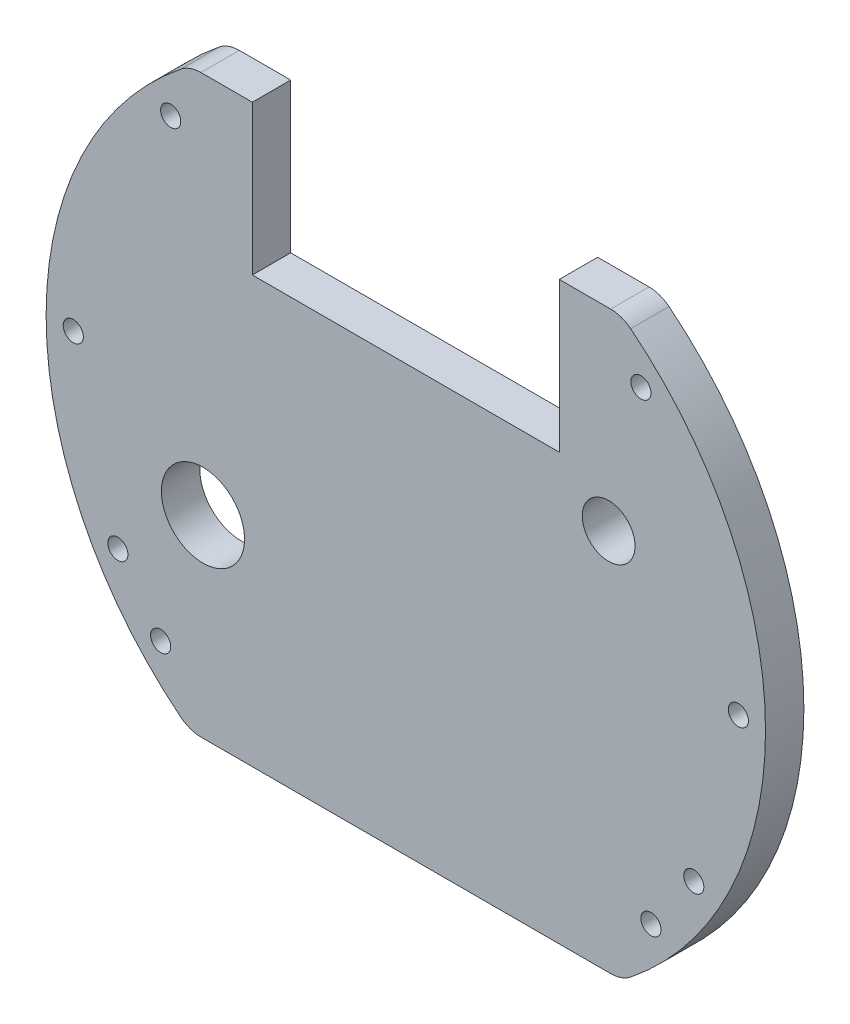
ISO-10303-21;
HEADER;
FILE_DESCRIPTION(('STEP AP214'),'2;1');
FILE_NAME('part.step','',(''),(''),'','','');
FILE_SCHEMA(('AUTOMOTIVE_DESIGN { 1 0 10303 214 1 1 1 1 }'));
ENDSEC;
DATA;
#1=APPLICATION_CONTEXT('core data for automotive mechanical design processes');
#2=APPLICATION_PROTOCOL_DEFINITION('international standard','automotive_design',2000,#1);
#3=PRODUCT_CONTEXT('',#1,'mechanical');
#4=PRODUCT('Part','Part','',(#3));
#5=PRODUCT_RELATED_PRODUCT_CATEGORY('part','',(#4));
#6=PRODUCT_DEFINITION_FORMATION('','',#4);
#7=PRODUCT_DEFINITION_CONTEXT('part definition',#1,'design');
#8=PRODUCT_DEFINITION('design','',#6,#7);
#9=PRODUCT_DEFINITION_SHAPE('','',#8);
#10=(LENGTH_UNIT() NAMED_UNIT(*) SI_UNIT(.MILLI.,.METRE.));
#11=(NAMED_UNIT(*) PLANE_ANGLE_UNIT() SI_UNIT($,.RADIAN.));
#12=(NAMED_UNIT(*) SI_UNIT($,.STERADIAN.) SOLID_ANGLE_UNIT());
#13=UNCERTAINTY_MEASURE_WITH_UNIT(LENGTH_MEASURE(1.E-05),#10,'distance_accuracy_value','');
#14=(GEOMETRIC_REPRESENTATION_CONTEXT(3) GLOBAL_UNCERTAINTY_ASSIGNED_CONTEXT((#13)) GLOBAL_UNIT_ASSIGNED_CONTEXT((#10,
#11,#12)) REPRESENTATION_CONTEXT('',''));
#15=CARTESIAN_POINT('',(0.,0.,0.));
#16=DIRECTION('',(0.,0.,1.));
#17=DIRECTION('',(1.,0.,0.));
#18=AXIS2_PLACEMENT_3D('',#15,#16,#17);
#19=CARTESIAN_POINT('',(-32.0400140449408,-40.,6.));
#20=DIRECTION('',(0.,0.,-1.));
#21=DIRECTION('',(-1.,0.,0.));
#22=AXIS2_PLACEMENT_3D('',#19,#20,#21);
#23=CYLINDRICAL_SURFACE('',#22,5.);
#24=CARTESIAN_POINT('',(-32.0400140449408,-40.,0.));
#25=DIRECTION('',(0.,0.,1.));
#26=DIRECTION('',(-1.,0.,0.));
#27=AXIS2_PLACEMENT_3D('',#24,#25,#26);
#28=CIRCLE('',#27,5.);
#29=CARTESIAN_POINT('',(-35.1658690737155,-43.9024390243902,0.));
#30=VERTEX_POINT('',#29);
#31=CARTESIAN_POINT('',(-32.0400140449408,-45.,0.));
#32=VERTEX_POINT('',#31);
#33=EDGE_CURVE('E164',#30,#32,#28,.T.);
#34=ORIENTED_EDGE('',*,*,#33,.T.);
#35=DIRECTION('',(0.,0.,-1.));
#36=VECTOR('',#35,1.);
#37=CARTESIAN_POINT('',(-32.0400140449408,-45.,6.));
#38=LINE('',#37,#36);
#39=CARTESIAN_POINT('',(-32.0400140449408,-45.,6.));
#40=VERTEX_POINT('',#39);
#41=EDGE_CURVE('E11',#40,#32,#38,.T.);
#42=ORIENTED_EDGE('',*,*,#41,.F.);
#43=CARTESIAN_POINT('',(-32.0400140449408,-40.,6.));
#44=DIRECTION('',(0.,0.,1.));
#45=DIRECTION('',(-1.,0.,0.));
#46=AXIS2_PLACEMENT_3D('',#43,#44,#45);
#47=CIRCLE('',#46,5.);
#48=CARTESIAN_POINT('',(-35.1658690737155,-43.9024390243902,6.));
#49=VERTEX_POINT('',#48);
#50=EDGE_CURVE('E187',#49,#40,#47,.T.);
#51=ORIENTED_EDGE('',*,*,#50,.F.);
#52=DIRECTION('',(0.,0.,-1.));
#53=VECTOR('',#52,1.);
#54=CARTESIAN_POINT('',(-35.1658690737155,-43.9024390243902,6.));
#55=LINE('',#54,#53);
#56=EDGE_CURVE('E160',#49,#30,#55,.T.);
#57=ORIENTED_EDGE('',*,*,#56,.T.);
#58=EDGE_LOOP('',(#34,#42,#51,#57));
#59=FACE_BOUND('',#58,.T.);
#60=ADVANCED_FACE('F44',(#59),#23,.T.);
#61=CARTESIAN_POINT('',(32.0400140449408,-45.,6.));
#62=DIRECTION('',(0.,1.,0.));
#63=DIRECTION('',(0.,0.,1.));
#64=AXIS2_PLACEMENT_3D('',#61,#62,#63);
#65=PLANE('',#64);
#66=DIRECTION('',(1.,0.,0.));
#67=VECTOR('',#66,1.);
#68=CARTESIAN_POINT('',(32.0400140449408,-45.,0.));
#69=LINE('',#68,#67);
#70=CARTESIAN_POINT('',(32.0400140449408,-45.,0.));
#71=VERTEX_POINT('',#70);
#72=EDGE_CURVE('E167',#32,#71,#69,.T.);
#73=ORIENTED_EDGE('',*,*,#72,.T.);
#74=DIRECTION('',(0.,0.,-1.));
#75=VECTOR('',#74,1.);
#76=CARTESIAN_POINT('',(32.0400140449408,-45.,6.));
#77=LINE('',#76,#75);
#78=CARTESIAN_POINT('',(32.0400140449408,-45.,6.));
#79=VERTEX_POINT('',#78);
#80=EDGE_CURVE('E52',#79,#71,#77,.T.);
#81=ORIENTED_EDGE('',*,*,#80,.F.);
#82=DIRECTION('',(1.,0.,0.));
#83=VECTOR('',#82,1.);
#84=CARTESIAN_POINT('',(32.0400140449408,-45.,6.));
#85=LINE('',#84,#83);
#86=EDGE_CURVE('E115',#40,#79,#85,.T.);
#87=ORIENTED_EDGE('',*,*,#86,.F.);
#88=ORIENTED_EDGE('',*,*,#41,.T.);
#89=EDGE_LOOP('',(#73,#81,#87,#88));
#90=FACE_BOUND('',#89,.T.);
#91=ADVANCED_FACE('F266',(#90),#65,.F.);
#92=CARTESIAN_POINT('',(32.0400140449408,-40.,6.));
#93=DIRECTION('',(0.,0.,-1.));
#94=DIRECTION('',(-1.,0.,0.));
#95=AXIS2_PLACEMENT_3D('',#92,#93,#94);
#96=CYLINDRICAL_SURFACE('',#95,5.);
#97=CARTESIAN_POINT('',(32.0400140449408,-40.,0.));
#98=DIRECTION('',(0.,0.,1.));
#99=DIRECTION('',(1.,0.,0.));
#100=AXIS2_PLACEMENT_3D('',#97,#98,#99);
#101=CIRCLE('',#100,5.);
#102=CARTESIAN_POINT('',(35.1658690737155,-43.9024390243902,0.));
#103=VERTEX_POINT('',#102);
#104=EDGE_CURVE('E170',#71,#103,#101,.T.);
#105=ORIENTED_EDGE('',*,*,#104,.T.);
#106=DIRECTION('',(0.,0.,-1.));
#107=VECTOR('',#106,1.);
#108=CARTESIAN_POINT('',(35.1658690737155,-43.9024390243902,6.));
#109=LINE('',#108,#107);
#110=CARTESIAN_POINT('',(35.1658690737155,-43.9024390243902,6.));
#111=VERTEX_POINT('',#110);
#112=EDGE_CURVE('E206',#111,#103,#109,.T.);
#113=ORIENTED_EDGE('',*,*,#112,.F.);
#114=CARTESIAN_POINT('',(32.0400140449408,-40.,6.));
#115=DIRECTION('',(0.,0.,1.));
#116=DIRECTION('',(1.,0.,0.));
#117=AXIS2_PLACEMENT_3D('',#114,#115,#116);
#118=CIRCLE('',#117,5.);
#119=EDGE_CURVE('E214',#79,#111,#118,.T.);
#120=ORIENTED_EDGE('',*,*,#119,.F.);
#121=ORIENTED_EDGE('',*,*,#80,.T.);
#122=EDGE_LOOP('',(#105,#113,#120,#121));
#123=FACE_BOUND('',#122,.T.);
#124=ADVANCED_FACE('F212',(#123),#96,.T.);
#125=CARTESIAN_POINT('',(0.,0.,6.));
#126=DIRECTION('',(0.,0.,-1.));
#127=DIRECTION('',(-1.,0.,0.));
#128=AXIS2_PLACEMENT_3D('',#125,#126,#127);
#129=CYLINDRICAL_SURFACE('',#128,56.25);
#130=CARTESIAN_POINT('',(0.,0.,0.));
#131=DIRECTION('',(0.,0.,1.));
#132=DIRECTION('',(1.,0.,0.));
#133=AXIS2_PLACEMENT_3D('',#130,#131,#132);
#134=CIRCLE('',#133,56.25);
#135=CARTESIAN_POINT('',(35.1658690737155,43.9024390243902,0.));
#136=VERTEX_POINT('',#135);
#137=EDGE_CURVE('E172',#103,#136,#134,.T.);
#138=ORIENTED_EDGE('',*,*,#137,.T.);
#139=DIRECTION('',(0.,0.,-1.));
#140=VECTOR('',#139,1.);
#141=CARTESIAN_POINT('',(35.1658690737155,43.9024390243902,6.));
#142=LINE('',#141,#140);
#143=CARTESIAN_POINT('',(35.1658690737155,43.9024390243902,6.));
#144=VERTEX_POINT('',#143);
#145=EDGE_CURVE('E203',#144,#136,#142,.T.);
#146=ORIENTED_EDGE('',*,*,#145,.F.);
#147=CARTESIAN_POINT('',(0.,0.,6.));
#148=DIRECTION('',(0.,0.,1.));
#149=DIRECTION('',(1.,0.,0.));
#150=AXIS2_PLACEMENT_3D('',#147,#148,#149);
#151=CIRCLE('',#150,56.25);
#152=EDGE_CURVE('E232',#111,#144,#151,.T.);
#153=ORIENTED_EDGE('',*,*,#152,.F.);
#154=ORIENTED_EDGE('',*,*,#112,.T.);
#155=EDGE_LOOP('',(#138,#146,#153,#154));
#156=FACE_BOUND('',#155,.T.);
#157=ADVANCED_FACE('F223',(#156),#129,.T.);
#158=CARTESIAN_POINT('',(32.0400140449408,40.,6.));
#159=DIRECTION('',(0.,0.,-1.));
#160=DIRECTION('',(-1.,0.,0.));
#161=AXIS2_PLACEMENT_3D('',#158,#159,#160);
#162=CYLINDRICAL_SURFACE('',#161,5.);
#163=CARTESIAN_POINT('',(32.0400140449408,40.,0.));
#164=DIRECTION('',(0.,0.,1.));
#165=DIRECTION('',(-1.,0.,0.));
#166=AXIS2_PLACEMENT_3D('',#163,#164,#165);
#167=CIRCLE('',#166,5.);
#168=CARTESIAN_POINT('',(32.0400140449408,45.,0.));
#169=VERTEX_POINT('',#168);
#170=EDGE_CURVE('E174',#136,#169,#167,.T.);
#171=ORIENTED_EDGE('',*,*,#170,.T.);
#172=DIRECTION('',(0.,0.,-1.));
#173=VECTOR('',#172,1.);
#174=CARTESIAN_POINT('',(32.0400140449408,45.,6.));
#175=LINE('',#174,#173);
#176=CARTESIAN_POINT('',(32.0400140449408,45.,6.));
#177=VERTEX_POINT('',#176);
#178=EDGE_CURVE('E200',#177,#169,#175,.T.);
#179=ORIENTED_EDGE('',*,*,#178,.F.);
#180=CARTESIAN_POINT('',(32.0400140449408,40.,6.));
#181=DIRECTION('',(0.,0.,1.));
#182=DIRECTION('',(-1.,0.,0.));
#183=AXIS2_PLACEMENT_3D('',#180,#181,#182);
#184=CIRCLE('',#183,5.);
#185=EDGE_CURVE('E229',#144,#177,#184,.T.);
#186=ORIENTED_EDGE('',*,*,#185,.F.);
#187=ORIENTED_EDGE('',*,*,#145,.T.);
#188=EDGE_LOOP('',(#171,#179,#186,#187));
#189=FACE_BOUND('',#188,.T.);
#190=ADVANCED_FACE('F227',(#189),#162,.T.);
#191=CARTESIAN_POINT('',(32.0400140449408,45.,6.));
#192=DIRECTION('',(0.,-1.,0.));
#193=DIRECTION('',(0.,0.,-1.));
#194=AXIS2_PLACEMENT_3D('',#191,#192,#193);
#195=PLANE('',#194);
#196=DIRECTION('',(-1.,0.,0.));
#197=VECTOR('',#196,1.);
#198=CARTESIAN_POINT('',(32.0400140449408,45.,0.));
#199=LINE('',#198,#197);
#200=CARTESIAN_POINT('',(24.,45.,0.));
#201=VERTEX_POINT('',#200);
#202=EDGE_CURVE('E176',#169,#201,#199,.T.);
#203=ORIENTED_EDGE('',*,*,#202,.T.);
#204=DIRECTION('',(0.,0.,-1.));
#205=VECTOR('',#204,1.);
#206=CARTESIAN_POINT('',(24.,45.,6.));
#207=LINE('',#206,#205);
#208=CARTESIAN_POINT('',(24.,45.,6.));
#209=VERTEX_POINT('',#208);
#210=EDGE_CURVE('E197',#209,#201,#207,.T.);
#211=ORIENTED_EDGE('',*,*,#210,.F.);
#212=DIRECTION('',(-1.,0.,0.));
#213=VECTOR('',#212,1.);
#214=CARTESIAN_POINT('',(32.0400140449408,45.,6.));
#215=LINE('',#214,#213);
#216=EDGE_CURVE('E231',#177,#209,#215,.T.);
#217=ORIENTED_EDGE('',*,*,#216,.F.);
#218=ORIENTED_EDGE('',*,*,#178,.T.);
#219=EDGE_LOOP('',(#203,#211,#217,#218));
#220=FACE_BOUND('',#219,.T.);
#221=ADVANCED_FACE('F279',(#220),#195,.F.);
#222=CARTESIAN_POINT('',(24.,21.6,6.));
#223=DIRECTION('',(1.,0.,0.));
#224=DIRECTION('',(0.,0.,-1.));
#225=AXIS2_PLACEMENT_3D('',#222,#223,#224);
#226=PLANE('',#225);
#227=DIRECTION('',(0.,-1.,0.));
#228=VECTOR('',#227,1.);
#229=CARTESIAN_POINT('',(24.,21.6,0.));
#230=LINE('',#229,#228);
#231=CARTESIAN_POINT('',(24.,21.6,0.));
#232=VERTEX_POINT('',#231);
#233=EDGE_CURVE('E178',#201,#232,#230,.T.);
#234=ORIENTED_EDGE('',*,*,#233,.T.);
#235=DIRECTION('',(0.,0.,-1.));
#236=VECTOR('',#235,1.);
#237=CARTESIAN_POINT('',(24.,21.6,6.));
#238=LINE('',#237,#236);
#239=CARTESIAN_POINT('',(24.,21.6,6.));
#240=VERTEX_POINT('',#239);
#241=EDGE_CURVE('E194',#240,#232,#238,.T.);
#242=ORIENTED_EDGE('',*,*,#241,.F.);
#243=DIRECTION('',(0.,-1.,0.));
#244=VECTOR('',#243,1.);
#245=CARTESIAN_POINT('',(24.,21.6,6.));
#246=LINE('',#245,#244);
#247=EDGE_CURVE('E234',#209,#240,#246,.T.);
#248=ORIENTED_EDGE('',*,*,#247,.F.);
#249=ORIENTED_EDGE('',*,*,#210,.T.);
#250=EDGE_LOOP('',(#234,#242,#248,#249));
#251=FACE_BOUND('',#250,.T.);
#252=ADVANCED_FACE('F282',(#251),#226,.F.);
#253=CARTESIAN_POINT('',(24.,21.6,6.));
#254=DIRECTION('',(0.,-1.,0.));
#255=DIRECTION('',(1.,0.,0.));
#256=AXIS2_PLACEMENT_3D('',#253,#254,#255);
#257=PLANE('',#256);
#258=DIRECTION('',(-1.,0.,0.));
#259=VECTOR('',#258,1.);
#260=CARTESIAN_POINT('',(24.,21.6,0.));
#261=LINE('',#260,#259);
#262=CARTESIAN_POINT('',(-24.,21.6,0.));
#263=VERTEX_POINT('',#262);
#264=EDGE_CURVE('E180',#232,#263,#261,.T.);
#265=ORIENTED_EDGE('',*,*,#264,.T.);
#266=DIRECTION('',(0.,0.,-1.));
#267=VECTOR('',#266,1.);
#268=CARTESIAN_POINT('',(-24.,21.6,6.));
#269=LINE('',#268,#267);
#270=CARTESIAN_POINT('',(-24.,21.6,6.));
#271=VERTEX_POINT('',#270);
#272=EDGE_CURVE('E191',#271,#263,#269,.T.);
#273=ORIENTED_EDGE('',*,*,#272,.F.);
#274=DIRECTION('',(-1.,0.,0.));
#275=VECTOR('',#274,1.);
#276=CARTESIAN_POINT('',(24.,21.6,6.));
#277=LINE('',#276,#275);
#278=EDGE_CURVE('E240',#240,#271,#277,.T.);
#279=ORIENTED_EDGE('',*,*,#278,.F.);
#280=ORIENTED_EDGE('',*,*,#241,.T.);
#281=EDGE_LOOP('',(#265,#273,#279,#280));
#282=FACE_BOUND('',#281,.T.);
#283=ADVANCED_FACE('F246',(#282),#257,.F.);
#284=CARTESIAN_POINT('',(-24.,21.6,6.));
#285=DIRECTION('',(-1.,0.,0.));
#286=DIRECTION('',(0.,-1.,0.));
#287=AXIS2_PLACEMENT_3D('',#284,#285,#286);
#288=PLANE('',#287);
#289=DIRECTION('',(0.,1.,0.));
#290=VECTOR('',#289,1.);
#291=CARTESIAN_POINT('',(-24.,21.6,0.));
#292=LINE('',#291,#290);
#293=CARTESIAN_POINT('',(-24.,45.,0.));
#294=VERTEX_POINT('',#293);
#295=EDGE_CURVE('E182',#263,#294,#292,.T.);
#296=ORIENTED_EDGE('',*,*,#295,.T.);
#297=DIRECTION('',(0.,0.,-1.));
#298=VECTOR('',#297,1.);
#299=CARTESIAN_POINT('',(-24.,45.,6.));
#300=LINE('',#299,#298);
#301=CARTESIAN_POINT('',(-24.,45.,6.));
#302=VERTEX_POINT('',#301);
#303=EDGE_CURVE('E155',#302,#294,#300,.T.);
#304=ORIENTED_EDGE('',*,*,#303,.F.);
#305=DIRECTION('',(0.,1.,0.));
#306=VECTOR('',#305,1.);
#307=CARTESIAN_POINT('',(-24.,21.6,6.));
#308=LINE('',#307,#306);
#309=EDGE_CURVE('E146',#271,#302,#308,.T.);
#310=ORIENTED_EDGE('',*,*,#309,.F.);
#311=ORIENTED_EDGE('',*,*,#272,.T.);
#312=EDGE_LOOP('',(#296,#304,#310,#311));
#313=FACE_BOUND('',#312,.T.);
#314=ADVANCED_FACE('F250',(#313),#288,.F.);
#315=CARTESIAN_POINT('',(-24.,45.,6.));
#316=DIRECTION('',(0.,-1.,0.));
#317=DIRECTION('',(0.,0.,-1.));
#318=AXIS2_PLACEMENT_3D('',#315,#316,#317);
#319=PLANE('',#318);
#320=DIRECTION('',(-1.,0.,0.));
#321=VECTOR('',#320,1.);
#322=CARTESIAN_POINT('',(-24.,45.,0.));
#323=LINE('',#322,#321);
#324=CARTESIAN_POINT('',(-32.0400140449408,45.,0.));
#325=VERTEX_POINT('',#324);
#326=EDGE_CURVE('E154',#294,#325,#323,.T.);
#327=ORIENTED_EDGE('',*,*,#326,.T.);
#328=DIRECTION('',(0.,0.,-1.));
#329=VECTOR('',#328,1.);
#330=CARTESIAN_POINT('',(-32.0400140449408,45.,6.));
#331=LINE('',#330,#329);
#332=CARTESIAN_POINT('',(-32.0400140449408,45.,6.));
#333=VERTEX_POINT('',#332);
#334=EDGE_CURVE('E151',#333,#325,#331,.T.);
#335=ORIENTED_EDGE('',*,*,#334,.F.);
#336=DIRECTION('',(-1.,0.,0.));
#337=VECTOR('',#336,1.);
#338=CARTESIAN_POINT('',(-24.,45.,6.));
#339=LINE('',#338,#337);
#340=EDGE_CURVE('E140',#302,#333,#339,.T.);
#341=ORIENTED_EDGE('',*,*,#340,.F.);
#342=ORIENTED_EDGE('',*,*,#303,.T.);
#343=EDGE_LOOP('',(#327,#335,#341,#342));
#344=FACE_BOUND('',#343,.T.);
#345=ADVANCED_FACE('F152',(#344),#319,.F.);
#346=CARTESIAN_POINT('',(-32.0400140449408,40.,6.));
#347=DIRECTION('',(0.,0.,-1.));
#348=DIRECTION('',(-1.,0.,0.));
#349=AXIS2_PLACEMENT_3D('',#346,#347,#348);
#350=CYLINDRICAL_SURFACE('',#349,5.);
#351=CARTESIAN_POINT('',(-32.0400140449408,40.,0.));
#352=DIRECTION('',(0.,0.,1.));
#353=DIRECTION('',(1.,0.,0.));
#354=AXIS2_PLACEMENT_3D('',#351,#352,#353);
#355=CIRCLE('',#354,5.);
#356=CARTESIAN_POINT('',(-35.1658690737155,43.9024390243902,0.));
#357=VERTEX_POINT('',#356);
#358=EDGE_CURVE('E101',#325,#357,#355,.T.);
#359=ORIENTED_EDGE('',*,*,#358,.T.);
#360=DIRECTION('',(0.,0.,-1.));
#361=VECTOR('',#360,1.);
#362=CARTESIAN_POINT('',(-35.1658690737155,43.9024390243902,6.));
#363=LINE('',#362,#361);
#364=CARTESIAN_POINT('',(-35.1658690737155,43.9024390243902,6.));
#365=VERTEX_POINT('',#364);
#366=EDGE_CURVE('E156',#365,#357,#363,.T.);
#367=ORIENTED_EDGE('',*,*,#366,.F.);
#368=CARTESIAN_POINT('',(-32.0400140449408,40.,6.));
#369=DIRECTION('',(0.,0.,1.));
#370=DIRECTION('',(1.,0.,0.));
#371=AXIS2_PLACEMENT_3D('',#368,#369,#370);
#372=CIRCLE('',#371,5.);
#373=EDGE_CURVE('E144',#333,#365,#372,.T.);
#374=ORIENTED_EDGE('',*,*,#373,.F.);
#375=ORIENTED_EDGE('',*,*,#334,.T.);
#376=EDGE_LOOP('',(#359,#367,#374,#375));
#377=FACE_BOUND('',#376,.T.);
#378=ADVANCED_FACE('F158',(#377),#350,.T.);
#379=CARTESIAN_POINT('',(0.,0.,6.));
#380=DIRECTION('',(0.,0.,-1.));
#381=DIRECTION('',(-1.,0.,0.));
#382=AXIS2_PLACEMENT_3D('',#379,#380,#381);
#383=CYLINDRICAL_SURFACE('',#382,56.25);
#384=CARTESIAN_POINT('',(0.,0.,0.));
#385=DIRECTION('',(0.,0.,1.));
#386=DIRECTION('',(1.,0.,0.));
#387=AXIS2_PLACEMENT_3D('',#384,#385,#386);
#388=CIRCLE('',#387,56.25);
#389=EDGE_CURVE('E107',#357,#30,#388,.T.);
#390=ORIENTED_EDGE('',*,*,#389,.T.);
#391=ORIENTED_EDGE('',*,*,#56,.F.);
#392=CARTESIAN_POINT('',(0.,0.,6.));
#393=DIRECTION('',(0.,0.,1.));
#394=DIRECTION('',(1.,0.,0.));
#395=AXIS2_PLACEMENT_3D('',#392,#393,#394);
#396=CIRCLE('',#395,56.25);
#397=EDGE_CURVE('E60',#365,#49,#396,.T.);
#398=ORIENTED_EDGE('',*,*,#397,.F.);
#399=ORIENTED_EDGE('',*,*,#366,.T.);
#400=EDGE_LOOP('',(#390,#391,#398,#399));
#401=FACE_BOUND('',#400,.T.);
#402=ADVANCED_FACE('F254',(#401),#383,.T.);
#403=CARTESIAN_POINT('',(-32.0400140449408,-40.,6.));
#404=DIRECTION('',(0.,0.,-1.));
#405=DIRECTION('',(-1.,0.,0.));
#406=AXIS2_PLACEMENT_3D('',#403,#404,#405);
#407=PLANE('',#406);
#408=CARTESIAN_POINT('',(-31.7207725462826,-14.7916391609247,6.));
#409=DIRECTION('',(0.,0.,-1.));
#410=DIRECTION('',(-1.,0.,0.));
#411=AXIS2_PLACEMENT_3D('',#408,#409,#410);
#412=CIRCLE('',#411,6.5);
#413=CARTESIAN_POINT('',(-38.2207725462826,-14.7916391609247,6.));
#414=VERTEX_POINT('',#413);
#415=EDGE_CURVE('E576',#414,#414,#412,.T.);
#416=ORIENTED_EDGE('',*,*,#415,.T.);
#417=EDGE_LOOP('',(#416));
#418=FACE_BOUND('',#417,.T.);
#419=CARTESIAN_POINT('',(31.7207725462827,14.7916391609245,6.));
#420=DIRECTION('',(0.,0.,-1.));
#421=DIRECTION('',(-1.,0.,0.));
#422=AXIS2_PLACEMENT_3D('',#419,#420,#421);
#423=CIRCLE('',#422,4.125);
#424=CARTESIAN_POINT('',(27.5957725462827,14.7916391609245,6.));
#425=VERTEX_POINT('',#424);
#426=EDGE_CURVE('E580',#425,#425,#423,.T.);
#427=ORIENTED_EDGE('',*,*,#426,.T.);
#428=EDGE_LOOP('',(#427));
#429=FACE_BOUND('',#428,.T.);
#430=CARTESIAN_POINT('',(36.7695526217004,36.7695526217005,6.));
#431=DIRECTION('',(0.,0.,-1.));
#432=DIRECTION('',(-1.,0.,0.));
#433=AXIS2_PLACEMENT_3D('',#430,#431,#432);
#434=CIRCLE('',#433,1.575);
#435=CARTESIAN_POINT('',(35.1945526217004,36.7695526217005,6.));
#436=VERTEX_POINT('',#435);
#437=EDGE_CURVE('E589',#436,#436,#434,.T.);
#438=ORIENTED_EDGE('',*,*,#437,.T.);
#439=EDGE_LOOP('',(#438));
#440=FACE_BOUND('',#439,.T.);
#441=CARTESIAN_POINT('',(52.,-3.63114059239686E-13,6.));
#442=DIRECTION('',(0.,0.,-1.));
#443=DIRECTION('',(-1.,0.,0.));
#444=AXIS2_PLACEMENT_3D('',#441,#442,#443);
#445=CIRCLE('',#444,1.575);
#446=CARTESIAN_POINT('',(50.425,-3.63114059239686E-13,6.));
#447=VERTEX_POINT('',#446);
#448=EDGE_CURVE('E595',#447,#447,#445,.T.);
#449=ORIENTED_EDGE('',*,*,#448,.T.);
#450=EDGE_LOOP('',(#449));
#451=FACE_BOUND('',#450,.T.);
#452=CARTESIAN_POINT('',(45.0333209967908,-26.0000000000001,6.));
#453=DIRECTION('',(0.,0.,-1.));
#454=DIRECTION('',(-1.,0.,0.));
#455=AXIS2_PLACEMENT_3D('',#452,#453,#454);
#456=CIRCLE('',#455,1.575);
#457=CARTESIAN_POINT('',(43.4583209967908,-26.0000000000001,6.));
#458=VERTEX_POINT('',#457);
#459=EDGE_CURVE('E601',#458,#458,#456,.T.);
#460=ORIENTED_EDGE('',*,*,#459,.T.);
#461=EDGE_LOOP('',(#460));
#462=FACE_BOUND('',#461,.T.);
#463=CARTESIAN_POINT('',(-45.0333209967908,-26.,6.));
#464=DIRECTION('',(0.,0.,-1.));
#465=DIRECTION('',(-1.,0.,0.));
#466=AXIS2_PLACEMENT_3D('',#463,#464,#465);
#467=CIRCLE('',#466,1.575);
#468=CARTESIAN_POINT('',(-46.6083209967908,-26.,6.));
#469=VERTEX_POINT('',#468);
#470=EDGE_CURVE('E607',#469,#469,#467,.T.);
#471=ORIENTED_EDGE('',*,*,#470,.T.);
#472=EDGE_LOOP('',(#471));
#473=FACE_BOUND('',#472,.T.);
#474=CARTESIAN_POINT('',(-52.,0.,6.));
#475=DIRECTION('',(0.,0.,-1.));
#476=DIRECTION('',(-1.,0.,0.));
#477=AXIS2_PLACEMENT_3D('',#474,#475,#476);
#478=CIRCLE('',#477,1.575);
#479=CARTESIAN_POINT('',(-53.575,0.,6.));
#480=VERTEX_POINT('',#479);
#481=EDGE_CURVE('E613',#480,#480,#478,.T.);
#482=ORIENTED_EDGE('',*,*,#481,.T.);
#483=EDGE_LOOP('',(#482));
#484=FACE_BOUND('',#483,.T.);
#485=CARTESIAN_POINT('',(-36.7695526217004,36.7695526217005,6.));
#486=DIRECTION('',(0.,0.,-1.));
#487=DIRECTION('',(-1.,0.,0.));
#488=AXIS2_PLACEMENT_3D('',#485,#486,#487);
#489=CIRCLE('',#488,1.575);
#490=CARTESIAN_POINT('',(-38.3445526217004,36.7695526217005,6.));
#491=VERTEX_POINT('',#490);
#492=EDGE_CURVE('E619',#491,#491,#489,.T.);
#493=ORIENTED_EDGE('',*,*,#492,.T.);
#494=EDGE_LOOP('',(#493));
#495=FACE_BOUND('',#494,.T.);
#496=CARTESIAN_POINT('',(38.3384215141264,-35.1306907960144,6.));
#497=DIRECTION('',(0.,0.,-1.));
#498=DIRECTION('',(-1.,0.,0.));
#499=AXIS2_PLACEMENT_3D('',#496,#497,#498);
#500=CIRCLE('',#499,1.575);
#501=CARTESIAN_POINT('',(36.7634215141264,-35.1306907960144,6.));
#502=VERTEX_POINT('',#501);
#503=EDGE_CURVE('E625',#502,#502,#500,.T.);
#504=ORIENTED_EDGE('',*,*,#503,.T.);
#505=EDGE_LOOP('',(#504));
#506=FACE_BOUND('',#505,.T.);
#507=CARTESIAN_POINT('',(-38.3384215141264,-35.1306907960144,6.));
#508=DIRECTION('',(0.,0.,-1.));
#509=DIRECTION('',(-1.,0.,0.));
#510=AXIS2_PLACEMENT_3D('',#507,#508,#509);
#511=CIRCLE('',#510,1.575);
#512=CARTESIAN_POINT('',(-39.9134215141264,-35.1306907960144,6.));
#513=VERTEX_POINT('',#512);
#514=EDGE_CURVE('E168',#513,#513,#511,.T.);
#515=ORIENTED_EDGE('',*,*,#514,.T.);
#516=EDGE_LOOP('',(#515));
#517=FACE_BOUND('',#516,.T.);
#518=ORIENTED_EDGE('',*,*,#50,.T.);
#519=ORIENTED_EDGE('',*,*,#86,.T.);
#520=ORIENTED_EDGE('',*,*,#119,.T.);
#521=ORIENTED_EDGE('',*,*,#152,.T.);
#522=ORIENTED_EDGE('',*,*,#185,.T.);
#523=ORIENTED_EDGE('',*,*,#216,.T.);
#524=ORIENTED_EDGE('',*,*,#247,.T.);
#525=ORIENTED_EDGE('',*,*,#278,.T.);
#526=ORIENTED_EDGE('',*,*,#309,.T.);
#527=ORIENTED_EDGE('',*,*,#340,.T.);
#528=ORIENTED_EDGE('',*,*,#373,.T.);
#529=ORIENTED_EDGE('',*,*,#397,.T.);
#530=EDGE_LOOP('',(#518,#519,#520,#521,#522,#523,#524,#525,#526,#527,#528,#529));
#531=FACE_BOUND('',#530,.T.);
#532=ADVANCED_FACE('F142',(#418,#429,#440,#451,#462,#473,#484,#495,#506,#517,#531),#407,.F.);
#533=CARTESIAN_POINT('',(-32.0400140449408,-40.,0.));
#534=DIRECTION('',(0.,0.,-1.));
#535=DIRECTION('',(-1.,0.,0.));
#536=AXIS2_PLACEMENT_3D('',#533,#534,#535);
#537=PLANE('',#536);
#538=CARTESIAN_POINT('',(-31.7207725462826,-14.7916391609247,0.));
#539=DIRECTION('',(0.,0.,-1.));
#540=DIRECTION('',(-1.,0.,0.));
#541=AXIS2_PLACEMENT_3D('',#538,#539,#540);
#542=CIRCLE('',#541,6.5);
#543=CARTESIAN_POINT('',(-38.2207725462826,-14.7916391609247,0.));
#544=VERTEX_POINT('',#543);
#545=EDGE_CURVE('E573',#544,#544,#542,.T.);
#546=ORIENTED_EDGE('',*,*,#545,.F.);
#547=EDGE_LOOP('',(#546));
#548=FACE_BOUND('',#547,.T.);
#549=CARTESIAN_POINT('',(31.7207725462827,14.7916391609245,0.));
#550=DIRECTION('',(0.,0.,-1.));
#551=DIRECTION('',(-1.,0.,0.));
#552=AXIS2_PLACEMENT_3D('',#549,#550,#551);
#553=CIRCLE('',#552,4.125);
#554=CARTESIAN_POINT('',(27.5957725462827,14.7916391609245,0.));
#555=VERTEX_POINT('',#554);
#556=EDGE_CURVE('E577',#555,#555,#553,.T.);
#557=ORIENTED_EDGE('',*,*,#556,.F.);
#558=EDGE_LOOP('',(#557));
#559=FACE_BOUND('',#558,.T.);
#560=CARTESIAN_POINT('',(36.7695526217004,36.7695526217005,0.));
#561=DIRECTION('',(0.,0.,-1.));
#562=DIRECTION('',(-1.,0.,0.));
#563=AXIS2_PLACEMENT_3D('',#560,#561,#562);
#564=CIRCLE('',#563,1.575);
#565=CARTESIAN_POINT('',(35.1945526217004,36.7695526217005,0.));
#566=VERTEX_POINT('',#565);
#567=EDGE_CURVE('E586',#566,#566,#564,.T.);
#568=ORIENTED_EDGE('',*,*,#567,.F.);
#569=EDGE_LOOP('',(#568));
#570=FACE_BOUND('',#569,.T.);
#571=CARTESIAN_POINT('',(52.,-3.63114059239686E-13,0.));
#572=DIRECTION('',(0.,0.,-1.));
#573=DIRECTION('',(-1.,0.,0.));
#574=AXIS2_PLACEMENT_3D('',#571,#572,#573);
#575=CIRCLE('',#574,1.575);
#576=CARTESIAN_POINT('',(50.425,-3.63114059239686E-13,0.));
#577=VERTEX_POINT('',#576);
#578=EDGE_CURVE('E592',#577,#577,#575,.T.);
#579=ORIENTED_EDGE('',*,*,#578,.F.);
#580=EDGE_LOOP('',(#579));
#581=FACE_BOUND('',#580,.T.);
#582=CARTESIAN_POINT('',(45.0333209967908,-26.0000000000001,0.));
#583=DIRECTION('',(0.,0.,-1.));
#584=DIRECTION('',(-1.,0.,0.));
#585=AXIS2_PLACEMENT_3D('',#582,#583,#584);
#586=CIRCLE('',#585,1.575);
#587=CARTESIAN_POINT('',(43.4583209967908,-26.0000000000001,0.));
#588=VERTEX_POINT('',#587);
#589=EDGE_CURVE('E598',#588,#588,#586,.T.);
#590=ORIENTED_EDGE('',*,*,#589,.F.);
#591=EDGE_LOOP('',(#590));
#592=FACE_BOUND('',#591,.T.);
#593=CARTESIAN_POINT('',(-45.0333209967908,-26.,0.));
#594=DIRECTION('',(0.,0.,-1.));
#595=DIRECTION('',(-1.,0.,0.));
#596=AXIS2_PLACEMENT_3D('',#593,#594,#595);
#597=CIRCLE('',#596,1.575);
#598=CARTESIAN_POINT('',(-46.6083209967908,-26.,0.));
#599=VERTEX_POINT('',#598);
#600=EDGE_CURVE('E604',#599,#599,#597,.T.);
#601=ORIENTED_EDGE('',*,*,#600,.F.);
#602=EDGE_LOOP('',(#601));
#603=FACE_BOUND('',#602,.T.);
#604=CARTESIAN_POINT('',(-52.,0.,0.));
#605=DIRECTION('',(0.,0.,-1.));
#606=DIRECTION('',(-1.,0.,0.));
#607=AXIS2_PLACEMENT_3D('',#604,#605,#606);
#608=CIRCLE('',#607,1.575);
#609=CARTESIAN_POINT('',(-53.575,0.,0.));
#610=VERTEX_POINT('',#609);
#611=EDGE_CURVE('E610',#610,#610,#608,.T.);
#612=ORIENTED_EDGE('',*,*,#611,.F.);
#613=EDGE_LOOP('',(#612));
#614=FACE_BOUND('',#613,.T.);
#615=CARTESIAN_POINT('',(-36.7695526217004,36.7695526217005,0.));
#616=DIRECTION('',(0.,0.,-1.));
#617=DIRECTION('',(-1.,0.,0.));
#618=AXIS2_PLACEMENT_3D('',#615,#616,#617);
#619=CIRCLE('',#618,1.575);
#620=CARTESIAN_POINT('',(-38.3445526217004,36.7695526217005,0.));
#621=VERTEX_POINT('',#620);
#622=EDGE_CURVE('E616',#621,#621,#619,.T.);
#623=ORIENTED_EDGE('',*,*,#622,.F.);
#624=EDGE_LOOP('',(#623));
#625=FACE_BOUND('',#624,.T.);
#626=CARTESIAN_POINT('',(38.3384215141264,-35.1306907960144,0.));
#627=DIRECTION('',(0.,0.,-1.));
#628=DIRECTION('',(-1.,0.,0.));
#629=AXIS2_PLACEMENT_3D('',#626,#627,#628);
#630=CIRCLE('',#629,1.575);
#631=CARTESIAN_POINT('',(36.7634215141264,-35.1306907960144,0.));
#632=VERTEX_POINT('',#631);
#633=EDGE_CURVE('E622',#632,#632,#630,.T.);
#634=ORIENTED_EDGE('',*,*,#633,.F.);
#635=EDGE_LOOP('',(#634));
#636=FACE_BOUND('',#635,.T.);
#637=CARTESIAN_POINT('',(-38.3384215141264,-35.1306907960144,0.));
#638=DIRECTION('',(0.,0.,-1.));
#639=DIRECTION('',(-1.,0.,0.));
#640=AXIS2_PLACEMENT_3D('',#637,#638,#639);
#641=CIRCLE('',#640,1.575);
#642=CARTESIAN_POINT('',(-39.9134215141264,-35.1306907960144,0.));
#643=VERTEX_POINT('',#642);
#644=EDGE_CURVE('E628',#643,#643,#641,.T.);
#645=ORIENTED_EDGE('',*,*,#644,.F.);
#646=EDGE_LOOP('',(#645));
#647=FACE_BOUND('',#646,.T.);
#648=ORIENTED_EDGE('',*,*,#33,.F.);
#649=ORIENTED_EDGE('',*,*,#389,.F.);
#650=ORIENTED_EDGE('',*,*,#358,.F.);
#651=ORIENTED_EDGE('',*,*,#326,.F.);
#652=ORIENTED_EDGE('',*,*,#295,.F.);
#653=ORIENTED_EDGE('',*,*,#264,.F.);
#654=ORIENTED_EDGE('',*,*,#233,.F.);
#655=ORIENTED_EDGE('',*,*,#202,.F.);
#656=ORIENTED_EDGE('',*,*,#170,.F.);
#657=ORIENTED_EDGE('',*,*,#137,.F.);
#658=ORIENTED_EDGE('',*,*,#104,.F.);
#659=ORIENTED_EDGE('',*,*,#72,.F.);
#660=EDGE_LOOP('',(#648,#649,#650,#651,#652,#653,#654,#655,#656,#657,#658,#659));
#661=FACE_BOUND('',#660,.T.);
#662=ADVANCED_FACE('F218',(#548,#559,#570,#581,#592,#603,#614,#625,#636,#647,#661),#537,.T.);
#663=CARTESIAN_POINT('',(-38.3384215141264,-35.1306907960144,0.));
#664=DIRECTION('',(0.,0.,-1.));
#665=DIRECTION('',(-1.,0.,0.));
#666=AXIS2_PLACEMENT_3D('',#663,#664,#665);
#667=CYLINDRICAL_SURFACE('',#666,1.575);
#668=ORIENTED_EDGE('',*,*,#644,.T.);
#669=EDGE_LOOP('',(#668));
#670=FACE_BOUND('',#669,.T.);
#671=ORIENTED_EDGE('',*,*,#514,.F.);
#672=EDGE_LOOP('',(#671));
#673=FACE_BOUND('',#672,.T.);
#674=ADVANCED_FACE('F322',(#670,#673),#667,.F.);
#675=CARTESIAN_POINT('',(38.3384215141264,-35.1306907960144,0.));
#676=DIRECTION('',(0.,0.,-1.));
#677=DIRECTION('',(-1.,0.,0.));
#678=AXIS2_PLACEMENT_3D('',#675,#676,#677);
#679=CYLINDRICAL_SURFACE('',#678,1.575);
#680=ORIENTED_EDGE('',*,*,#633,.T.);
#681=EDGE_LOOP('',(#680));
#682=FACE_BOUND('',#681,.T.);
#683=ORIENTED_EDGE('',*,*,#503,.F.);
#684=EDGE_LOOP('',(#683));
#685=FACE_BOUND('',#684,.T.);
#686=ADVANCED_FACE('F329',(#682,#685),#679,.F.);
#687=CARTESIAN_POINT('',(-36.7695526217004,36.7695526217005,0.));
#688=DIRECTION('',(0.,0.,-1.));
#689=DIRECTION('',(-1.,0.,0.));
#690=AXIS2_PLACEMENT_3D('',#687,#688,#689);
#691=CYLINDRICAL_SURFACE('',#690,1.575);
#692=ORIENTED_EDGE('',*,*,#622,.T.);
#693=EDGE_LOOP('',(#692));
#694=FACE_BOUND('',#693,.T.);
#695=ORIENTED_EDGE('',*,*,#492,.F.);
#696=EDGE_LOOP('',(#695));
#697=FACE_BOUND('',#696,.T.);
#698=ADVANCED_FACE('F339',(#694,#697),#691,.F.);
#699=CARTESIAN_POINT('',(-52.,0.,0.));
#700=DIRECTION('',(0.,0.,-1.));
#701=DIRECTION('',(-1.,0.,0.));
#702=AXIS2_PLACEMENT_3D('',#699,#700,#701);
#703=CYLINDRICAL_SURFACE('',#702,1.575);
#704=ORIENTED_EDGE('',*,*,#611,.T.);
#705=EDGE_LOOP('',(#704));
#706=FACE_BOUND('',#705,.T.);
#707=ORIENTED_EDGE('',*,*,#481,.F.);
#708=EDGE_LOOP('',(#707));
#709=FACE_BOUND('',#708,.T.);
#710=ADVANCED_FACE('F349',(#706,#709),#703,.F.);
#711=CARTESIAN_POINT('',(-45.0333209967908,-26.,0.));
#712=DIRECTION('',(0.,0.,-1.));
#713=DIRECTION('',(-1.,0.,0.));
#714=AXIS2_PLACEMENT_3D('',#711,#712,#713);
#715=CYLINDRICAL_SURFACE('',#714,1.575);
#716=ORIENTED_EDGE('',*,*,#600,.T.);
#717=EDGE_LOOP('',(#716));
#718=FACE_BOUND('',#717,.T.);
#719=ORIENTED_EDGE('',*,*,#470,.F.);
#720=EDGE_LOOP('',(#719));
#721=FACE_BOUND('',#720,.T.);
#722=ADVANCED_FACE('F359',(#718,#721),#715,.F.);
#723=CARTESIAN_POINT('',(45.0333209967908,-26.0000000000001,0.));
#724=DIRECTION('',(0.,0.,-1.));
#725=DIRECTION('',(-1.,0.,0.));
#726=AXIS2_PLACEMENT_3D('',#723,#724,#725);
#727=CYLINDRICAL_SURFACE('',#726,1.575);
#728=ORIENTED_EDGE('',*,*,#589,.T.);
#729=EDGE_LOOP('',(#728));
#730=FACE_BOUND('',#729,.T.);
#731=ORIENTED_EDGE('',*,*,#459,.F.);
#732=EDGE_LOOP('',(#731));
#733=FACE_BOUND('',#732,.T.);
#734=ADVANCED_FACE('F369',(#730,#733),#727,.F.);
#735=CARTESIAN_POINT('',(52.,-3.63114059239686E-13,0.));
#736=DIRECTION('',(0.,0.,-1.));
#737=DIRECTION('',(-1.,0.,0.));
#738=AXIS2_PLACEMENT_3D('',#735,#736,#737);
#739=CYLINDRICAL_SURFACE('',#738,1.575);
#740=ORIENTED_EDGE('',*,*,#578,.T.);
#741=EDGE_LOOP('',(#740));
#742=FACE_BOUND('',#741,.T.);
#743=ORIENTED_EDGE('',*,*,#448,.F.);
#744=EDGE_LOOP('',(#743));
#745=FACE_BOUND('',#744,.T.);
#746=ADVANCED_FACE('F379',(#742,#745),#739,.F.);
#747=CARTESIAN_POINT('',(36.7695526217004,36.7695526217005,0.));
#748=DIRECTION('',(0.,0.,-1.));
#749=DIRECTION('',(-1.,0.,0.));
#750=AXIS2_PLACEMENT_3D('',#747,#748,#749);
#751=CYLINDRICAL_SURFACE('',#750,1.575);
#752=ORIENTED_EDGE('',*,*,#567,.T.);
#753=EDGE_LOOP('',(#752));
#754=FACE_BOUND('',#753,.T.);
#755=ORIENTED_EDGE('',*,*,#437,.F.);
#756=EDGE_LOOP('',(#755));
#757=FACE_BOUND('',#756,.T.);
#758=ADVANCED_FACE('F389',(#754,#757),#751,.F.);
#759=CARTESIAN_POINT('',(31.7207725462827,14.7916391609245,0.));
#760=DIRECTION('',(0.,0.,-1.));
#761=DIRECTION('',(-1.,0.,0.));
#762=AXIS2_PLACEMENT_3D('',#759,#760,#761);
#763=CYLINDRICAL_SURFACE('',#762,4.125);
#764=ORIENTED_EDGE('',*,*,#556,.T.);
#765=EDGE_LOOP('',(#764));
#766=FACE_BOUND('',#765,.T.);
#767=ORIENTED_EDGE('',*,*,#426,.F.);
#768=EDGE_LOOP('',(#767));
#769=FACE_BOUND('',#768,.T.);
#770=ADVANCED_FACE('F399',(#766,#769),#763,.F.);
#771=CARTESIAN_POINT('',(-31.7207725462826,-14.7916391609247,10.));
#772=DIRECTION('',(0.,0.,-1.));
#773=DIRECTION('',(-1.,0.,0.));
#774=AXIS2_PLACEMENT_3D('',#771,#772,#773);
#775=CYLINDRICAL_SURFACE('',#774,6.5);
#776=ORIENTED_EDGE('',*,*,#545,.T.);
#777=EDGE_LOOP('',(#776));
#778=FACE_BOUND('',#777,.T.);
#779=ORIENTED_EDGE('',*,*,#415,.F.);
#780=EDGE_LOOP('',(#779));
#781=FACE_BOUND('',#780,.T.);
#782=ADVANCED_FACE('F408',(#778,#781),#775,.F.);
#783=CLOSED_SHELL('',(#60,#91,#124,#157,#190,#221,#252,#283,#314,#345,#378,#402,#532,#662,#674,
#686,#698,#710,#722,#734,#746,#758,#770,#782));
#784=MANIFOLD_SOLID_BREP('B2',#783);
#785=ADVANCED_BREP_SHAPE_REPRESENTATION('',(#18,#784),#14);
#786=SHAPE_DEFINITION_REPRESENTATION(#9,#785);
ENDSEC;
END-ISO-10303-21;
